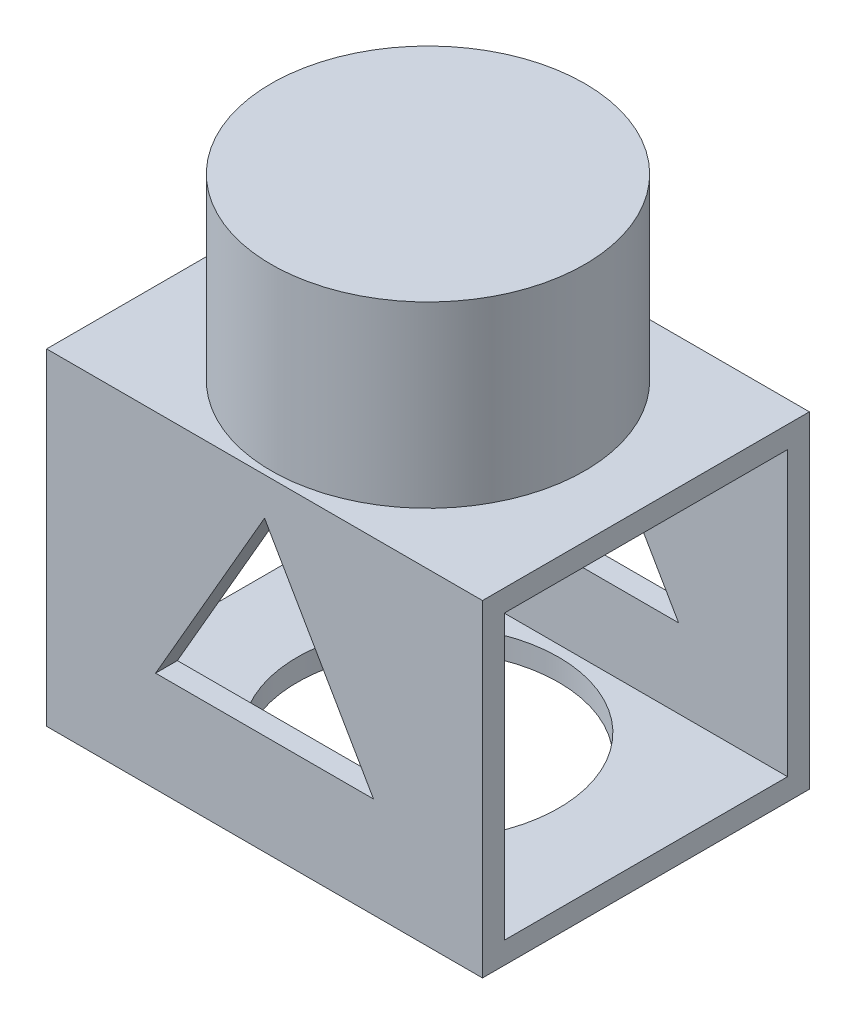
ISO-10303-21;
HEADER;
FILE_DESCRIPTION(('STEP AP214'),'2;1');
FILE_NAME('part.step','',(''),(''),'','','');
FILE_SCHEMA(('AUTOMOTIVE_DESIGN { 1 0 10303 214 1 1 1 1 }'));
ENDSEC;
DATA;
#1=APPLICATION_CONTEXT('core data for automotive mechanical design processes');
#2=APPLICATION_PROTOCOL_DEFINITION('international standard','automotive_design',2000,#1);
#3=PRODUCT_CONTEXT('',#1,'mechanical');
#4=PRODUCT('Part','Part','',(#3));
#5=PRODUCT_RELATED_PRODUCT_CATEGORY('part','',(#4));
#6=PRODUCT_DEFINITION_FORMATION('','',#4);
#7=PRODUCT_DEFINITION_CONTEXT('part definition',#1,'design');
#8=PRODUCT_DEFINITION('design','',#6,#7);
#9=PRODUCT_DEFINITION_SHAPE('','',#8);
#10=(LENGTH_UNIT() NAMED_UNIT(*) SI_UNIT(.MILLI.,.METRE.));
#11=(NAMED_UNIT(*) PLANE_ANGLE_UNIT() SI_UNIT($,.RADIAN.));
#12=(NAMED_UNIT(*) SI_UNIT($,.STERADIAN.) SOLID_ANGLE_UNIT());
#13=UNCERTAINTY_MEASURE_WITH_UNIT(LENGTH_MEASURE(1.E-05),#10,'distance_accuracy_value','');
#14=(GEOMETRIC_REPRESENTATION_CONTEXT(3) GLOBAL_UNCERTAINTY_ASSIGNED_CONTEXT((#13)) GLOBAL_UNIT_ASSIGNED_CONTEXT((#10,
#11,#12)) REPRESENTATION_CONTEXT('',''));
#15=CARTESIAN_POINT('',(0.,0.,0.));
#16=DIRECTION('',(0.,0.,1.));
#17=DIRECTION('',(1.,0.,0.));
#18=AXIS2_PLACEMENT_3D('',#15,#16,#17);
#19=CARTESIAN_POINT('',(50.,46.1324865405187,-75.));
#20=DIRECTION('',(0.866025403784438,0.5,0.));
#21=DIRECTION('',(-0.5,0.866025403784439,0.));
#22=AXIS2_PLACEMENT_3D('',#19,#20,#21);
#23=PLANE('',#22);
#24=DIRECTION('',(0.,0.,1.));
#25=VECTOR('',#24,1.);
#26=CARTESIAN_POINT('',(0.,132.735026918963,-75.));
#27=LINE('',#26,#25);
#28=CARTESIAN_POINT('',(0.,132.735026918963,65.));
#29=VERTEX_POINT('',#28);
#30=CARTESIAN_POINT('',(0.,132.735026918963,75.));
#31=VERTEX_POINT('',#30);
#32=EDGE_CURVE('E197',#29,#31,#27,.T.);
#33=ORIENTED_EDGE('',*,*,#32,.F.);
#34=DIRECTION('',(0.5,-0.866025403784439,0.));
#35=VECTOR('',#34,1.);
#36=CARTESIAN_POINT('',(50.,46.1324865405187,64.9999999999999));
#37=LINE('',#36,#35);
#38=CARTESIAN_POINT('',(50.,46.1324865405187,64.9999999999999));
#39=VERTEX_POINT('',#38);
#40=EDGE_CURVE('E183',#29,#39,#37,.T.);
#41=ORIENTED_EDGE('',*,*,#40,.T.);
#42=DIRECTION('',(0.,0.,1.));
#43=VECTOR('',#42,1.);
#44=CARTESIAN_POINT('',(50.,46.1324865405187,-75.));
#45=LINE('',#44,#43);
#46=CARTESIAN_POINT('',(50.,46.1324865405187,75.));
#47=VERTEX_POINT('',#46);
#48=EDGE_CURVE('E209',#39,#47,#45,.T.);
#49=ORIENTED_EDGE('',*,*,#48,.T.);
#50=DIRECTION('',(-0.5,0.866025403784438,0.));
#51=VECTOR('',#50,1.);
#52=CARTESIAN_POINT('',(50.,46.1324865405187,75.));
#53=LINE('',#52,#51);
#54=EDGE_CURVE('E186',#47,#31,#53,.T.);
#55=ORIENTED_EDGE('',*,*,#54,.T.);
#56=EDGE_LOOP('',(#33,#41,#49,#55));
#57=FACE_BOUND('',#56,.T.);
#58=ADVANCED_FACE('F33',(#57),#23,.F.);
#59=CARTESIAN_POINT('',(-50.,46.1324865405187,-75.));
#60=DIRECTION('',(0.,-1.,0.));
#61=DIRECTION('',(1.,0.,0.));
#62=AXIS2_PLACEMENT_3D('',#59,#60,#61);
#63=PLANE('',#62);
#64=ORIENTED_EDGE('',*,*,#48,.F.);
#65=DIRECTION('',(-1.,0.,0.));
#66=VECTOR('',#65,1.);
#67=CARTESIAN_POINT('',(-50.,46.1324865405187,65.));
#68=LINE('',#67,#66);
#69=CARTESIAN_POINT('',(-50.,46.1324865405187,65.));
#70=VERTEX_POINT('',#69);
#71=EDGE_CURVE('E180',#39,#70,#68,.T.);
#72=ORIENTED_EDGE('',*,*,#71,.T.);
#73=DIRECTION('',(0.,0.,1.));
#74=VECTOR('',#73,1.);
#75=CARTESIAN_POINT('',(-50.,46.1324865405187,-75.));
#76=LINE('',#75,#74);
#77=CARTESIAN_POINT('',(-50.,46.1324865405187,75.));
#78=VERTEX_POINT('',#77);
#79=EDGE_CURVE('E213',#70,#78,#76,.T.);
#80=ORIENTED_EDGE('',*,*,#79,.T.);
#81=DIRECTION('',(1.,0.,0.));
#82=VECTOR('',#81,1.);
#83=CARTESIAN_POINT('',(-50.,46.1324865405187,75.));
#84=LINE('',#83,#82);
#85=EDGE_CURVE('E191',#78,#47,#84,.T.);
#86=ORIENTED_EDGE('',*,*,#85,.T.);
#87=EDGE_LOOP('',(#64,#72,#80,#86));
#88=FACE_BOUND('',#87,.T.);
#89=ADVANCED_FACE('F273',(#88),#63,.F.);
#90=CARTESIAN_POINT('',(0.,132.735026918963,-75.));
#91=DIRECTION('',(-0.866025403784439,0.5,0.));
#92=DIRECTION('',(-0.5,-0.866025403784439,0.));
#93=AXIS2_PLACEMENT_3D('',#90,#91,#92);
#94=PLANE('',#93);
#95=ORIENTED_EDGE('',*,*,#79,.F.);
#96=DIRECTION('',(0.5,0.866025403784439,0.));
#97=VECTOR('',#96,1.);
#98=CARTESIAN_POINT('',(0.,132.735026918963,65.));
#99=LINE('',#98,#97);
#100=EDGE_CURVE('E11',#70,#29,#99,.T.);
#101=ORIENTED_EDGE('',*,*,#100,.T.);
#102=ORIENTED_EDGE('',*,*,#32,.T.);
#103=DIRECTION('',(-0.5,-0.866025403784439,0.));
#104=VECTOR('',#103,1.);
#105=CARTESIAN_POINT('',(0.,132.735026918963,75.));
#106=LINE('',#105,#104);
#107=EDGE_CURVE('E200',#31,#78,#106,.T.);
#108=ORIENTED_EDGE('',*,*,#107,.T.);
#109=EDGE_LOOP('',(#95,#101,#102,#108));
#110=FACE_BOUND('',#109,.T.);
#111=ADVANCED_FACE('F279',(#110),#94,.F.);
#112=CARTESIAN_POINT('',(-99.9999999999999,150.,75.));
#113=DIRECTION('',(1.,0.,0.));
#114=DIRECTION('',(0.,0.,-1.));
#115=AXIS2_PLACEMENT_3D('',#112,#113,#114);
#116=PLANE('',#115);
#117=DIRECTION('',(0.,0.,1.));
#118=VECTOR('',#117,1.);
#119=CARTESIAN_POINT('',(-100.,140.,-65.));
#120=LINE('',#119,#118);
#121=CARTESIAN_POINT('',(-100.,140.,-65.));
#122=VERTEX_POINT('',#121);
#123=CARTESIAN_POINT('',(-100.,140.,65.));
#124=VERTEX_POINT('',#123);
#125=EDGE_CURVE('E144',#122,#124,#120,.T.);
#126=ORIENTED_EDGE('',*,*,#125,.T.);
#127=DIRECTION('',(0.,-1.,0.));
#128=VECTOR('',#127,1.);
#129=CARTESIAN_POINT('',(-100.,10.,65.));
#130=LINE('',#129,#128);
#131=CARTESIAN_POINT('',(-100.,10.,65.));
#132=VERTEX_POINT('',#131);
#133=EDGE_CURVE('E138',#124,#132,#130,.T.);
#134=ORIENTED_EDGE('',*,*,#133,.T.);
#135=DIRECTION('',(0.,0.,-1.));
#136=VECTOR('',#135,1.);
#137=CARTESIAN_POINT('',(-100.,10.,-65.));
#138=LINE('',#137,#136);
#139=CARTESIAN_POINT('',(-99.9999999999999,10.,-65.));
#140=VERTEX_POINT('',#139);
#141=EDGE_CURVE('E147',#132,#140,#138,.T.);
#142=ORIENTED_EDGE('',*,*,#141,.T.);
#143=DIRECTION('',(0.,1.,0.));
#144=VECTOR('',#143,1.);
#145=CARTESIAN_POINT('',(-100.,10.,-65.));
#146=LINE('',#145,#144);
#147=EDGE_CURVE('E49',#140,#122,#146,.T.);
#148=ORIENTED_EDGE('',*,*,#147,.T.);
#149=EDGE_LOOP('',(#126,#134,#142,#148));
#150=FACE_BOUND('',#149,.T.);
#151=DIRECTION('',(0.,0.,1.));
#152=VECTOR('',#151,1.);
#153=CARTESIAN_POINT('',(-99.9999999999999,0.,75.));
#154=LINE('',#153,#152);
#155=CARTESIAN_POINT('',(-99.9999999999999,0.,-75.));
#156=VERTEX_POINT('',#155);
#157=CARTESIAN_POINT('',(-99.9999999999999,0.,75.));
#158=VERTEX_POINT('',#157);
#159=EDGE_CURVE('E208',#156,#158,#154,.T.);
#160=ORIENTED_EDGE('',*,*,#159,.T.);
#161=DIRECTION('',(0.,-1.,0.));
#162=VECTOR('',#161,1.);
#163=CARTESIAN_POINT('',(-99.9999999999999,150.,75.));
#164=LINE('',#163,#162);
#165=CARTESIAN_POINT('',(-99.9999999999999,150.,75.));
#166=VERTEX_POINT('',#165);
#167=EDGE_CURVE('E243',#166,#158,#164,.T.);
#168=ORIENTED_EDGE('',*,*,#167,.F.);
#169=DIRECTION('',(0.,0.,1.));
#170=VECTOR('',#169,1.);
#171=CARTESIAN_POINT('',(-99.9999999999999,150.,75.));
#172=LINE('',#171,#170);
#173=CARTESIAN_POINT('',(-99.9999999999999,150.,-75.));
#174=VERTEX_POINT('',#173);
#175=EDGE_CURVE('E217',#174,#166,#172,.T.);
#176=ORIENTED_EDGE('',*,*,#175,.F.);
#177=DIRECTION('',(0.,-1.,0.));
#178=VECTOR('',#177,1.);
#179=CARTESIAN_POINT('',(-99.9999999999999,150.,-75.));
#180=LINE('',#179,#178);
#181=EDGE_CURVE('E227',#174,#156,#180,.T.);
#182=ORIENTED_EDGE('',*,*,#181,.T.);
#183=EDGE_LOOP('',(#160,#168,#176,#182));
#184=FACE_BOUND('',#183,.T.);
#185=ADVANCED_FACE('F35',(#150,#184),#116,.F.);
#186=CARTESIAN_POINT('',(100.,150.,75.));
#187=DIRECTION('',(0.,0.,-1.));
#188=DIRECTION('',(-1.,0.,0.));
#189=AXIS2_PLACEMENT_3D('',#186,#187,#188);
#190=PLANE('',#189);
#191=ORIENTED_EDGE('',*,*,#107,.F.);
#192=ORIENTED_EDGE('',*,*,#54,.F.);
#193=ORIENTED_EDGE('',*,*,#85,.F.);
#194=EDGE_LOOP('',(#191,#192,#193));
#195=FACE_BOUND('',#194,.T.);
#196=DIRECTION('',(1.,0.,0.));
#197=VECTOR('',#196,1.);
#198=CARTESIAN_POINT('',(100.,0.,75.));
#199=LINE('',#198,#197);
#200=CARTESIAN_POINT('',(100.,0.,75.));
#201=VERTEX_POINT('',#200);
#202=EDGE_CURVE('E230',#158,#201,#199,.T.);
#203=ORIENTED_EDGE('',*,*,#202,.T.);
#204=DIRECTION('',(0.,-1.,0.));
#205=VECTOR('',#204,1.);
#206=CARTESIAN_POINT('',(100.,150.,75.));
#207=LINE('',#206,#205);
#208=CARTESIAN_POINT('',(100.,150.,75.));
#209=VERTEX_POINT('',#208);
#210=EDGE_CURVE('E240',#209,#201,#207,.T.);
#211=ORIENTED_EDGE('',*,*,#210,.F.);
#212=DIRECTION('',(1.,0.,0.));
#213=VECTOR('',#212,1.);
#214=CARTESIAN_POINT('',(100.,150.,75.));
#215=LINE('',#214,#213);
#216=EDGE_CURVE('E220',#166,#209,#215,.T.);
#217=ORIENTED_EDGE('',*,*,#216,.F.);
#218=ORIENTED_EDGE('',*,*,#167,.T.);
#219=EDGE_LOOP('',(#203,#211,#217,#218));
#220=FACE_BOUND('',#219,.T.);
#221=ADVANCED_FACE('F305',(#195,#220),#190,.F.);
#222=CARTESIAN_POINT('',(100.,150.,75.));
#223=DIRECTION('',(-1.,0.,0.));
#224=DIRECTION('',(0.,0.,1.));
#225=AXIS2_PLACEMENT_3D('',#222,#223,#224);
#226=PLANE('',#225);
#227=DIRECTION('',(0.,0.,-1.));
#228=VECTOR('',#227,1.);
#229=CARTESIAN_POINT('',(100.,10.,-65.));
#230=LINE('',#229,#228);
#231=CARTESIAN_POINT('',(100.,10.,65.));
#232=VERTEX_POINT('',#231);
#233=CARTESIAN_POINT('',(100.,10.,-65.));
#234=VERTEX_POINT('',#233);
#235=EDGE_CURVE('E165',#232,#234,#230,.T.);
#236=ORIENTED_EDGE('',*,*,#235,.F.);
#237=DIRECTION('',(0.,-1.,0.));
#238=VECTOR('',#237,1.);
#239=CARTESIAN_POINT('',(100.,10.,65.));
#240=LINE('',#239,#238);
#241=CARTESIAN_POINT('',(100.,140.,65.));
#242=VERTEX_POINT('',#241);
#243=EDGE_CURVE('E57',#242,#232,#240,.T.);
#244=ORIENTED_EDGE('',*,*,#243,.F.);
#245=DIRECTION('',(0.,0.,1.));
#246=VECTOR('',#245,1.);
#247=CARTESIAN_POINT('',(100.,140.,-65.));
#248=LINE('',#247,#246);
#249=CARTESIAN_POINT('',(100.,140.,-65.));
#250=VERTEX_POINT('',#249);
#251=EDGE_CURVE('E153',#250,#242,#248,.T.);
#252=ORIENTED_EDGE('',*,*,#251,.F.);
#253=DIRECTION('',(0.,1.,0.));
#254=VECTOR('',#253,1.);
#255=CARTESIAN_POINT('',(100.,10.,-65.));
#256=LINE('',#255,#254);
#257=EDGE_CURVE('E156',#234,#250,#256,.T.);
#258=ORIENTED_EDGE('',*,*,#257,.F.);
#259=EDGE_LOOP('',(#236,#244,#252,#258));
#260=FACE_BOUND('',#259,.T.);
#261=DIRECTION('',(0.,0.,-1.));
#262=VECTOR('',#261,1.);
#263=CARTESIAN_POINT('',(100.,0.,75.));
#264=LINE('',#263,#262);
#265=CARTESIAN_POINT('',(100.,0.,-75.));
#266=VERTEX_POINT('',#265);
#267=EDGE_CURVE('E232',#201,#266,#264,.T.);
#268=ORIENTED_EDGE('',*,*,#267,.T.);
#269=DIRECTION('',(0.,-1.,0.));
#270=VECTOR('',#269,1.);
#271=CARTESIAN_POINT('',(100.,150.,-75.));
#272=LINE('',#271,#270);
#273=CARTESIAN_POINT('',(100.,150.,-75.));
#274=VERTEX_POINT('',#273);
#275=EDGE_CURVE('E237',#274,#266,#272,.T.);
#276=ORIENTED_EDGE('',*,*,#275,.F.);
#277=DIRECTION('',(0.,0.,-1.));
#278=VECTOR('',#277,1.);
#279=CARTESIAN_POINT('',(100.,150.,75.));
#280=LINE('',#279,#278);
#281=EDGE_CURVE('E223',#209,#274,#280,.T.);
#282=ORIENTED_EDGE('',*,*,#281,.F.);
#283=ORIENTED_EDGE('',*,*,#210,.T.);
#284=EDGE_LOOP('',(#268,#276,#282,#283));
#285=FACE_BOUND('',#284,.T.);
#286=ADVANCED_FACE('F303',(#260,#285),#226,.F.);
#287=CARTESIAN_POINT('',(100.,150.,-75.));
#288=DIRECTION('',(0.,0.,1.));
#289=DIRECTION('',(1.,0.,0.));
#290=AXIS2_PLACEMENT_3D('',#287,#288,#289);
#291=PLANE('',#290);
#292=DIRECTION('',(1.,0.,0.));
#293=VECTOR('',#292,1.);
#294=CARTESIAN_POINT('',(-50.,46.1324865405187,-75.));
#295=LINE('',#294,#293);
#296=CARTESIAN_POINT('',(-50.,46.1324865405187,-75.));
#297=VERTEX_POINT('',#296);
#298=CARTESIAN_POINT('',(50.,46.1324865405187,-75.));
#299=VERTEX_POINT('',#298);
#300=EDGE_CURVE('E194',#297,#299,#295,.T.);
#301=ORIENTED_EDGE('',*,*,#300,.T.);
#302=DIRECTION('',(-0.5,0.866025403784438,0.));
#303=VECTOR('',#302,1.);
#304=CARTESIAN_POINT('',(50.,46.1324865405187,-75.));
#305=LINE('',#304,#303);
#306=CARTESIAN_POINT('',(0.,132.735026918963,-75.));
#307=VERTEX_POINT('',#306);
#308=EDGE_CURVE('E187',#299,#307,#305,.T.);
#309=ORIENTED_EDGE('',*,*,#308,.T.);
#310=DIRECTION('',(-0.5,-0.866025403784439,0.));
#311=VECTOR('',#310,1.);
#312=CARTESIAN_POINT('',(0.,132.735026918963,-75.));
#313=LINE('',#312,#311);
#314=EDGE_CURVE('E190',#307,#297,#313,.T.);
#315=ORIENTED_EDGE('',*,*,#314,.T.);
#316=EDGE_LOOP('',(#301,#309,#315));
#317=FACE_BOUND('',#316,.T.);
#318=DIRECTION('',(-1.,0.,0.));
#319=VECTOR('',#318,1.);
#320=CARTESIAN_POINT('',(100.,0.,-75.));
#321=LINE('',#320,#319);
#322=EDGE_CURVE('E221',#266,#156,#321,.T.);
#323=ORIENTED_EDGE('',*,*,#322,.T.);
#324=ORIENTED_EDGE('',*,*,#181,.F.);
#325=DIRECTION('',(-1.,0.,0.));
#326=VECTOR('',#325,1.);
#327=CARTESIAN_POINT('',(100.,150.,-75.));
#328=LINE('',#327,#326);
#329=EDGE_CURVE('E225',#274,#174,#328,.T.);
#330=ORIENTED_EDGE('',*,*,#329,.F.);
#331=ORIENTED_EDGE('',*,*,#275,.T.);
#332=EDGE_LOOP('',(#323,#324,#330,#331));
#333=FACE_BOUND('',#332,.T.);
#334=ADVANCED_FACE('F256',(#317,#333),#291,.F.);
#335=CARTESIAN_POINT('',(0.,150.,0.));
#336=DIRECTION('',(0.,1.,0.));
#337=DIRECTION('',(0.,0.,1.));
#338=AXIS2_PLACEMENT_3D('',#335,#336,#337);
#339=PLANE('',#338);
#340=CARTESIAN_POINT('',(0.,150.,0.));
#341=DIRECTION('',(0.,1.,0.));
#342=DIRECTION('',(0.,0.,1.));
#343=AXIS2_PLACEMENT_3D('',#340,#341,#342);
#344=CIRCLE('',#343,71.933937190608);
#345=CARTESIAN_POINT('',(0.,150.,-71.933937190608));
#346=VERTEX_POINT('',#345);
#347=EDGE_CURVE('E431',#346,#346,#344,.T.);
#348=ORIENTED_EDGE('',*,*,#347,.F.);
#349=EDGE_LOOP('',(#348));
#350=FACE_BOUND('',#349,.T.);
#351=ORIENTED_EDGE('',*,*,#175,.T.);
#352=ORIENTED_EDGE('',*,*,#216,.T.);
#353=ORIENTED_EDGE('',*,*,#281,.T.);
#354=ORIENTED_EDGE('',*,*,#329,.T.);
#355=EDGE_LOOP('',(#351,#352,#353,#354));
#356=FACE_BOUND('',#355,.T.);
#357=ADVANCED_FACE('F291',(#350,#356),#339,.T.);
#358=CARTESIAN_POINT('',(0.,0.,0.));
#359=DIRECTION('',(0.,1.,0.));
#360=DIRECTION('',(0.,0.,1.));
#361=AXIS2_PLACEMENT_3D('',#358,#359,#360);
#362=PLANE('',#361);
#363=CARTESIAN_POINT('',(0.,0.,0.));
#364=DIRECTION('',(0.,1.,0.));
#365=DIRECTION('',(0.,0.,1.));
#366=AXIS2_PLACEMENT_3D('',#363,#364,#365);
#367=CIRCLE('',#366,60.);
#368=CARTESIAN_POINT('',(0.,0.,60.));
#369=VERTEX_POINT('',#368);
#370=EDGE_CURVE('E434',#369,#369,#367,.T.);
#371=ORIENTED_EDGE('',*,*,#370,.T.);
#372=EDGE_LOOP('',(#371));
#373=FACE_BOUND('',#372,.T.);
#374=ORIENTED_EDGE('',*,*,#159,.F.);
#375=ORIENTED_EDGE('',*,*,#322,.F.);
#376=ORIENTED_EDGE('',*,*,#267,.F.);
#377=ORIENTED_EDGE('',*,*,#202,.F.);
#378=EDGE_LOOP('',(#374,#375,#376,#377));
#379=FACE_BOUND('',#378,.T.);
#380=ADVANCED_FACE('F286',(#373,#379),#362,.F.);
#381=CARTESIAN_POINT('',(50.,46.1324865405187,-65.));
#382=VERTEX_POINT('',#381);
#383=EDGE_CURVE('E205',#299,#382,#45,.T.);
#384=ORIENTED_EDGE('',*,*,#383,.T.);
#385=DIRECTION('',(-0.5,0.866025403784439,0.));
#386=VECTOR('',#385,1.);
#387=CARTESIAN_POINT('',(50.,46.1324865405187,-65.));
#388=LINE('',#387,#386);
#389=CARTESIAN_POINT('',(0.,132.735026918963,-65.));
#390=VERTEX_POINT('',#389);
#391=EDGE_CURVE('E177',#382,#390,#388,.T.);
#392=ORIENTED_EDGE('',*,*,#391,.T.);
#393=EDGE_CURVE('E214',#307,#390,#27,.T.);
#394=ORIENTED_EDGE('',*,*,#393,.F.);
#395=ORIENTED_EDGE('',*,*,#308,.F.);
#396=EDGE_LOOP('',(#384,#392,#394,#395));
#397=FACE_BOUND('',#396,.T.);
#398=ADVANCED_FACE('F259',(#397),#23,.F.);
#399=CARTESIAN_POINT('',(-50.,46.1324865405187,-65.));
#400=VERTEX_POINT('',#399);
#401=EDGE_CURVE('E210',#297,#400,#76,.T.);
#402=ORIENTED_EDGE('',*,*,#401,.T.);
#403=DIRECTION('',(1.,0.,0.));
#404=VECTOR('',#403,1.);
#405=CARTESIAN_POINT('',(-50.,46.1324865405187,-65.));
#406=LINE('',#405,#404);
#407=EDGE_CURVE('E171',#400,#382,#406,.T.);
#408=ORIENTED_EDGE('',*,*,#407,.T.);
#409=ORIENTED_EDGE('',*,*,#383,.F.);
#410=ORIENTED_EDGE('',*,*,#300,.F.);
#411=EDGE_LOOP('',(#402,#408,#409,#410));
#412=FACE_BOUND('',#411,.T.);
#413=ADVANCED_FACE('F253',(#412),#63,.F.);
#414=ORIENTED_EDGE('',*,*,#393,.T.);
#415=DIRECTION('',(-0.5,-0.866025403784439,0.));
#416=VECTOR('',#415,1.);
#417=CARTESIAN_POINT('',(0.,132.735026918963,-65.));
#418=LINE('',#417,#416);
#419=EDGE_CURVE('E42',#390,#400,#418,.T.);
#420=ORIENTED_EDGE('',*,*,#419,.T.);
#421=ORIENTED_EDGE('',*,*,#401,.F.);
#422=ORIENTED_EDGE('',*,*,#314,.F.);
#423=EDGE_LOOP('',(#414,#420,#421,#422));
#424=FACE_BOUND('',#423,.T.);
#425=ADVANCED_FACE('F249',(#424),#94,.F.);
#426=CARTESIAN_POINT('',(-100.,10.,65.));
#427=DIRECTION('',(0.,0.,1.));
#428=DIRECTION('',(1.,0.,0.));
#429=AXIS2_PLACEMENT_3D('',#426,#427,#428);
#430=PLANE('',#429);
#431=ORIENTED_EDGE('',*,*,#243,.T.);
#432=DIRECTION('',(1.,0.,0.));
#433=VECTOR('',#432,1.);
#434=CARTESIAN_POINT('',(-100.,10.,65.));
#435=LINE('',#434,#433);
#436=EDGE_CURVE('E133',#132,#232,#435,.T.);
#437=ORIENTED_EDGE('',*,*,#436,.F.);
#438=ORIENTED_EDGE('',*,*,#133,.F.);
#439=DIRECTION('',(1.,0.,0.));
#440=VECTOR('',#439,1.);
#441=CARTESIAN_POINT('',(-100.,140.,65.));
#442=LINE('',#441,#440);
#443=EDGE_CURVE('E169',#124,#242,#442,.T.);
#444=ORIENTED_EDGE('',*,*,#443,.T.);
#445=EDGE_LOOP('',(#431,#437,#438,#444));
#446=FACE_BOUND('',#445,.T.);
#447=ORIENTED_EDGE('',*,*,#100,.F.);
#448=ORIENTED_EDGE('',*,*,#71,.F.);
#449=ORIENTED_EDGE('',*,*,#40,.F.);
#450=EDGE_LOOP('',(#447,#448,#449));
#451=FACE_BOUND('',#450,.T.);
#452=ADVANCED_FACE('F135',(#446,#451),#430,.F.);
#453=CARTESIAN_POINT('',(-100.,10.,-65.));
#454=DIRECTION('',(0.,0.,-1.));
#455=DIRECTION('',(0.,1.,0.));
#456=AXIS2_PLACEMENT_3D('',#453,#454,#455);
#457=PLANE('',#456);
#458=ORIENTED_EDGE('',*,*,#257,.T.);
#459=DIRECTION('',(1.,0.,0.));
#460=VECTOR('',#459,1.);
#461=CARTESIAN_POINT('',(-100.,140.,-65.));
#462=LINE('',#461,#460);
#463=EDGE_CURVE('E172',#122,#250,#462,.T.);
#464=ORIENTED_EDGE('',*,*,#463,.F.);
#465=ORIENTED_EDGE('',*,*,#147,.F.);
#466=DIRECTION('',(1.,0.,0.));
#467=VECTOR('',#466,1.);
#468=CARTESIAN_POINT('',(-100.,10.,-65.));
#469=LINE('',#468,#467);
#470=EDGE_CURVE('E143',#140,#234,#469,.T.);
#471=ORIENTED_EDGE('',*,*,#470,.T.);
#472=EDGE_LOOP('',(#458,#464,#465,#471));
#473=FACE_BOUND('',#472,.T.);
#474=ORIENTED_EDGE('',*,*,#407,.F.);
#475=ORIENTED_EDGE('',*,*,#419,.F.);
#476=ORIENTED_EDGE('',*,*,#391,.F.);
#477=EDGE_LOOP('',(#474,#475,#476));
#478=FACE_BOUND('',#477,.T.);
#479=ADVANCED_FACE('F260',(#473,#478),#457,.F.);
#480=CARTESIAN_POINT('',(-100.,140.,-65.));
#481=DIRECTION('',(0.,1.,0.));
#482=DIRECTION('',(0.,0.,1.));
#483=AXIS2_PLACEMENT_3D('',#480,#481,#482);
#484=PLANE('',#483);
#485=CARTESIAN_POINT('',(0.,140.,0.));
#486=DIRECTION('',(0.,1.,0.));
#487=DIRECTION('',(0.,0.,1.));
#488=AXIS2_PLACEMENT_3D('',#485,#486,#487);
#489=CIRCLE('',#488,60.);
#490=CARTESIAN_POINT('',(0.,140.,60.));
#491=VERTEX_POINT('',#490);
#492=EDGE_CURVE('E159',#491,#491,#489,.T.);
#493=ORIENTED_EDGE('',*,*,#492,.T.);
#494=EDGE_LOOP('',(#493));
#495=FACE_BOUND('',#494,.T.);
#496=ORIENTED_EDGE('',*,*,#251,.T.);
#497=ORIENTED_EDGE('',*,*,#443,.F.);
#498=ORIENTED_EDGE('',*,*,#125,.F.);
#499=ORIENTED_EDGE('',*,*,#463,.T.);
#500=EDGE_LOOP('',(#496,#497,#498,#499));
#501=FACE_BOUND('',#500,.T.);
#502=ADVANCED_FACE('F262',(#495,#501),#484,.F.);
#503=CARTESIAN_POINT('',(-100.,10.,-65.));
#504=DIRECTION('',(0.,-1.,0.));
#505=DIRECTION('',(0.,0.,-1.));
#506=AXIS2_PLACEMENT_3D('',#503,#504,#505);
#507=PLANE('',#506);
#508=CARTESIAN_POINT('',(0.,10.,0.));
#509=DIRECTION('',(0.,-1.,0.));
#510=DIRECTION('',(0.,0.,-1.));
#511=AXIS2_PLACEMENT_3D('',#508,#509,#510);
#512=CIRCLE('',#511,60.);
#513=CARTESIAN_POINT('',(0.,10.,-60.));
#514=VERTEX_POINT('',#513);
#515=EDGE_CURVE('E37',#514,#514,#512,.T.);
#516=ORIENTED_EDGE('',*,*,#515,.T.);
#517=EDGE_LOOP('',(#516));
#518=FACE_BOUND('',#517,.T.);
#519=ORIENTED_EDGE('',*,*,#235,.T.);
#520=ORIENTED_EDGE('',*,*,#470,.F.);
#521=ORIENTED_EDGE('',*,*,#141,.F.);
#522=ORIENTED_EDGE('',*,*,#436,.T.);
#523=EDGE_LOOP('',(#519,#520,#521,#522));
#524=FACE_BOUND('',#523,.T.);
#525=ADVANCED_FACE('F148',(#518,#524),#507,.F.);
#526=CARTESIAN_POINT('',(0.,0.,0.));
#527=DIRECTION('',(0.,1.,0.));
#528=DIRECTION('',(0.,0.,1.));
#529=AXIS2_PLACEMENT_3D('',#526,#527,#528);
#530=CYLINDRICAL_SURFACE('',#529,60.);
#531=ORIENTED_EDGE('',*,*,#370,.F.);
#532=EDGE_LOOP('',(#531));
#533=FACE_BOUND('',#532,.T.);
#534=ORIENTED_EDGE('',*,*,#515,.F.);
#535=EDGE_LOOP('',(#534));
#536=FACE_BOUND('',#535,.T.);
#537=ADVANCED_FACE('F369',(#533,#536),#530,.F.);
#538=CARTESIAN_POINT('',(0.,150.,0.));
#539=DIRECTION('',(0.,1.,0.));
#540=DIRECTION('',(0.,0.,1.));
#541=AXIS2_PLACEMENT_3D('',#538,#539,#540);
#542=CIRCLE('',#541,60.);
#543=CARTESIAN_POINT('',(0.,150.,60.));
#544=VERTEX_POINT('',#543);
#545=EDGE_CURVE('E430',#544,#544,#542,.F.);
#546=ORIENTED_EDGE('',*,*,#545,.F.);
#547=EDGE_LOOP('',(#546));
#548=FACE_BOUND('',#547,.T.);
#549=ORIENTED_EDGE('',*,*,#492,.F.);
#550=EDGE_LOOP('',(#549));
#551=FACE_BOUND('',#550,.T.);
#552=ADVANCED_FACE('F378',(#548,#551),#530,.F.);
#553=CARTESIAN_POINT('',(0.,150.,0.));
#554=DIRECTION('',(0.,1.,0.));
#555=DIRECTION('',(0.,0.,1.));
#556=AXIS2_PLACEMENT_3D('',#553,#554,#555);
#557=PLANE('',#556);
#558=ORIENTED_EDGE('',*,*,#545,.T.);
#559=EDGE_LOOP('',(#558));
#560=FACE_BOUND('',#559,.T.);
#561=ADVANCED_FACE('F388',(#560),#557,.F.);
#562=CARTESIAN_POINT('',(0.,232.,0.));
#563=DIRECTION('',(0.,-1.,0.));
#564=DIRECTION('',(0.,0.,-1.));
#565=AXIS2_PLACEMENT_3D('',#562,#563,#564);
#566=CYLINDRICAL_SURFACE('',#565,71.933937190608);
#567=CARTESIAN_POINT('',(0.,232.,0.));
#568=DIRECTION('',(0.,1.,0.));
#569=DIRECTION('',(0.,0.,1.));
#570=AXIS2_PLACEMENT_3D('',#567,#568,#569);
#571=CIRCLE('',#570,71.933937190608);
#572=CARTESIAN_POINT('',(0.,232.,-71.933937190608));
#573=VERTEX_POINT('',#572);
#574=EDGE_CURVE('E429',#573,#573,#571,.T.);
#575=CARTESIAN_POINT('',(0.,232.,-71.933937190608));
#576=CARTESIAN_POINT('',(0.,231.145833333333,-71.933937190608));
#577=CARTESIAN_POINT('',(0.,230.291666666667,-71.933937190608));
#578=CARTESIAN_POINT('',(0.,228.583333333333,-71.933937190608));
#579=CARTESIAN_POINT('',(0.,227.729166666667,-71.933937190608));
#580=CARTESIAN_POINT('',(0.,226.020833333333,-71.933937190608));
#581=CARTESIAN_POINT('',(0.,225.166666666667,-71.933937190608));
#582=CARTESIAN_POINT('',(0.,223.458333333333,-71.933937190608));
#583=CARTESIAN_POINT('',(0.,222.604166666667,-71.933937190608));
#584=CARTESIAN_POINT('',(0.,220.895833333333,-71.933937190608));
#585=CARTESIAN_POINT('',(0.,220.041666666667,-71.933937190608));
#586=CARTESIAN_POINT('',(0.,218.333333333333,-71.933937190608));
#587=CARTESIAN_POINT('',(0.,217.479166666667,-71.933937190608));
#588=CARTESIAN_POINT('',(0.,215.770833333333,-71.933937190608));
#589=CARTESIAN_POINT('',(0.,214.916666666667,-71.933937190608));
#590=CARTESIAN_POINT('',(0.,213.208333333333,-71.933937190608));
#591=CARTESIAN_POINT('',(0.,212.354166666667,-71.933937190608));
#592=CARTESIAN_POINT('',(0.,210.645833333333,-71.933937190608));
#593=CARTESIAN_POINT('',(0.,209.791666666667,-71.933937190608));
#594=CARTESIAN_POINT('',(0.,208.083333333333,-71.933937190608));
#595=CARTESIAN_POINT('',(0.,207.229166666667,-71.933937190608));
#596=CARTESIAN_POINT('',(0.,205.520833333333,-71.933937190608));
#597=CARTESIAN_POINT('',(0.,204.666666666667,-71.933937190608));
#598=CARTESIAN_POINT('',(0.,202.958333333333,-71.933937190608));
#599=CARTESIAN_POINT('',(0.,202.104166666667,-71.933937190608));
#600=CARTESIAN_POINT('',(0.,200.395833333333,-71.933937190608));
#601=CARTESIAN_POINT('',(0.,199.541666666667,-71.933937190608));
#602=CARTESIAN_POINT('',(0.,197.833333333333,-71.933937190608));
#603=CARTESIAN_POINT('',(0.,196.979166666667,-71.933937190608));
#604=CARTESIAN_POINT('',(0.,195.270833333333,-71.933937190608));
#605=CARTESIAN_POINT('',(0.,194.416666666667,-71.933937190608));
#606=CARTESIAN_POINT('',(0.,192.708333333333,-71.933937190608));
#607=CARTESIAN_POINT('',(0.,191.854166666667,-71.933937190608));
#608=CARTESIAN_POINT('',(0.,190.145833333333,-71.933937190608));
#609=CARTESIAN_POINT('',(0.,189.291666666667,-71.933937190608));
#610=CARTESIAN_POINT('',(0.,187.583333333333,-71.933937190608));
#611=CARTESIAN_POINT('',(0.,186.729166666667,-71.933937190608));
#612=CARTESIAN_POINT('',(0.,185.020833333333,-71.933937190608));
#613=CARTESIAN_POINT('',(0.,184.166666666667,-71.933937190608));
#614=CARTESIAN_POINT('',(0.,182.458333333333,-71.933937190608));
#615=CARTESIAN_POINT('',(0.,181.604166666667,-71.933937190608));
#616=CARTESIAN_POINT('',(0.,179.895833333333,-71.933937190608));
#617=CARTESIAN_POINT('',(0.,179.041666666667,-71.933937190608));
#618=CARTESIAN_POINT('',(0.,177.333333333333,-71.933937190608));
#619=CARTESIAN_POINT('',(0.,176.479166666667,-71.933937190608));
#620=CARTESIAN_POINT('',(0.,174.770833333333,-71.933937190608));
#621=CARTESIAN_POINT('',(0.,173.916666666667,-71.933937190608));
#622=CARTESIAN_POINT('',(0.,172.208333333333,-71.933937190608));
#623=CARTESIAN_POINT('',(0.,171.354166666667,-71.933937190608));
#624=CARTESIAN_POINT('',(0.,169.645833333333,-71.933937190608));
#625=CARTESIAN_POINT('',(0.,168.791666666667,-71.933937190608));
#626=CARTESIAN_POINT('',(0.,167.083333333333,-71.933937190608));
#627=CARTESIAN_POINT('',(0.,166.229166666667,-71.933937190608));
#628=CARTESIAN_POINT('',(0.,164.520833333333,-71.933937190608));
#629=CARTESIAN_POINT('',(0.,163.666666666667,-71.933937190608));
#630=CARTESIAN_POINT('',(0.,161.958333333333,-71.933937190608));
#631=CARTESIAN_POINT('',(0.,161.104166666667,-71.933937190608));
#632=CARTESIAN_POINT('',(0.,159.395833333333,-71.933937190608));
#633=CARTESIAN_POINT('',(0.,158.541666666667,-71.933937190608));
#634=CARTESIAN_POINT('',(0.,156.833333333333,-71.933937190608));
#635=CARTESIAN_POINT('',(0.,155.979166666667,-71.933937190608));
#636=CARTESIAN_POINT('',(0.,154.270833333333,-71.933937190608));
#637=CARTESIAN_POINT('',(0.,153.416666666667,-71.933937190608));
#638=CARTESIAN_POINT('',(0.,151.708333333333,-71.933937190608));
#639=CARTESIAN_POINT('',(0.,150.854166666667,-71.933937190608));
#640=CARTESIAN_POINT('',(0.,150.,-71.933937190608));
#641=B_SPLINE_CURVE_WITH_KNOTS('',3,(#575,#576,#577,#578,#579,#580,#581,#582,#583,#584,#585,
#586,#587,#588,#589,#590,#591,#592,#593,#594,#595,#596,#597,#598,#599,#600,#601,#602,#603,#604,
#605,#606,#607,#608,#609,#610,#611,#612,#613,#614,#615,#616,#617,#618,#619,#620,#621,#622,#623,
#624,#625,#626,#627,#628,#629,#630,#631,#632,#633,#634,#635,#636,#637,#638,#639,#640),
.UNSPECIFIED.,.F.,.F.,(4,2,2,2,2,2,2,2,2,2,2,2,2,2,2,2,2,2,2,2,2,2,2,2,2,2,2,2,2,2,2,2,4),(0.,
2.5625,5.12499999999999,7.68749999999999,10.25,12.8125,15.375,17.9375,20.5,23.0625,25.625,
28.1875,30.75,33.3125,35.875,38.4375,41.,43.5625,46.1249999999999,48.6874999999999,
51.2499999999999,53.8125,56.375,58.9375,61.4999999999999,64.0624999999999,66.6249999999999,
69.1874999999999,71.7499999999999,74.3124999999999,76.8749999999999,79.4374999999999,
81.9999999999999),.UNSPECIFIED.);
#642=EDGE_CURVE('BSEAM403',#573,#346,#641,.T.);
#643=ORIENTED_EDGE('',*,*,#574,.F.);
#644=ORIENTED_EDGE('',*,*,#347,.T.);
#645=ORIENTED_EDGE('',*,*,#642,.T.);
#646=ORIENTED_EDGE('',*,*,#642,.F.);
#647=EDGE_LOOP('',(#643,#645,#644,#646));
#648=FACE_BOUND('',#647,.T.);
#649=ADVANCED_FACE('F403',(#648),#566,.T.);
#650=CARTESIAN_POINT('',(0.,232.,0.));
#651=DIRECTION('',(0.,1.,0.));
#652=DIRECTION('',(0.,0.,1.));
#653=AXIS2_PLACEMENT_3D('',#650,#651,#652);
#654=PLANE('',#653);
#655=ORIENTED_EDGE('',*,*,#574,.T.);
#656=EDGE_LOOP('',(#655));
#657=FACE_BOUND('',#656,.T.);
#658=ADVANCED_FACE('F413',(#657),#654,.T.);
#659=CLOSED_SHELL('',(#58,#89,#111,#185,#221,#286,#334,#357,#380,#398,#413,#425,#452,#479,#502,
#525,#537,#552,#561,#649,#658));
#660=MANIFOLD_SOLID_BREP('B2',#659);
#661=ADVANCED_BREP_SHAPE_REPRESENTATION('',(#18,#660),#14);
#662=SHAPE_DEFINITION_REPRESENTATION(#9,#661);
ENDSEC;
END-ISO-10303-21;
